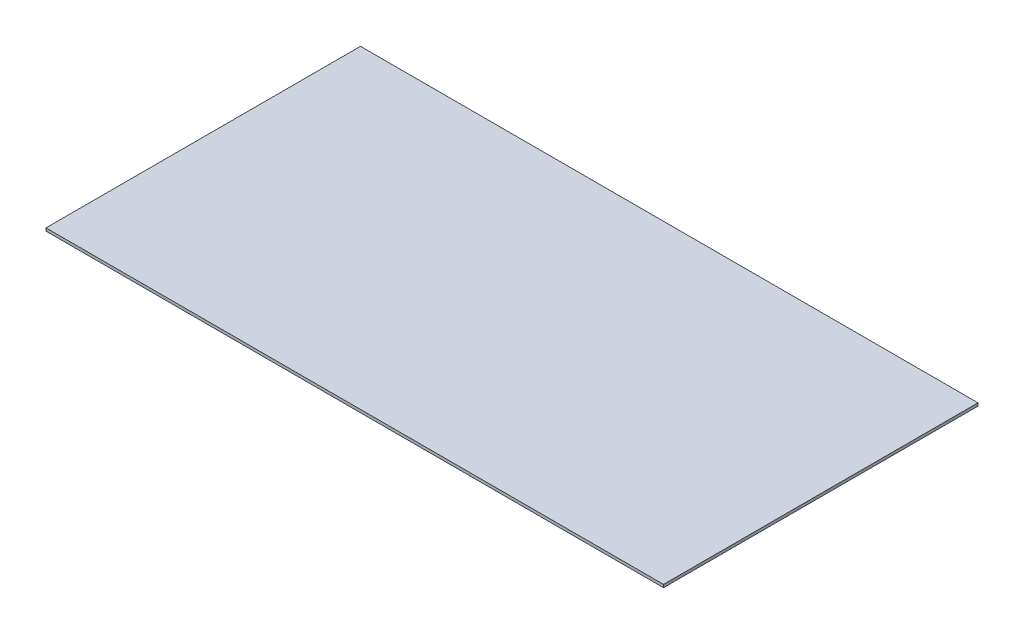
ISO-10303-21;
HEADER;
FILE_DESCRIPTION(('STEP AP214'),'2;1');
FILE_NAME('part.step','',(''),(''),'','','');
FILE_SCHEMA(('AUTOMOTIVE_DESIGN { 1 0 10303 214 1 1 1 1 }'));
ENDSEC;
DATA;
#1=APPLICATION_CONTEXT('core data for automotive mechanical design processes');
#2=APPLICATION_PROTOCOL_DEFINITION('international standard','automotive_design',2000,#1);
#3=PRODUCT_CONTEXT('',#1,'mechanical');
#4=PRODUCT('Part','Part','',(#3));
#5=PRODUCT_RELATED_PRODUCT_CATEGORY('part','',(#4));
#6=PRODUCT_DEFINITION_FORMATION('','',#4);
#7=PRODUCT_DEFINITION_CONTEXT('part definition',#1,'design');
#8=PRODUCT_DEFINITION('design','',#6,#7);
#9=PRODUCT_DEFINITION_SHAPE('','',#8);
#10=(LENGTH_UNIT() NAMED_UNIT(*) SI_UNIT(.MILLI.,.METRE.));
#11=(NAMED_UNIT(*) PLANE_ANGLE_UNIT() SI_UNIT($,.RADIAN.));
#12=(NAMED_UNIT(*) SI_UNIT($,.STERADIAN.) SOLID_ANGLE_UNIT());
#13=UNCERTAINTY_MEASURE_WITH_UNIT(LENGTH_MEASURE(1.E-05),#10,'distance_accuracy_value','');
#14=(GEOMETRIC_REPRESENTATION_CONTEXT(3) GLOBAL_UNCERTAINTY_ASSIGNED_CONTEXT((#13)) GLOBAL_UNIT_ASSIGNED_CONTEXT((#10,
#11,#12)) REPRESENTATION_CONTEXT('',''));
#15=CARTESIAN_POINT('',(0.,0.,0.));
#16=DIRECTION('',(0.,0.,1.));
#17=DIRECTION('',(1.,0.,0.));
#18=AXIS2_PLACEMENT_3D('',#15,#16,#17);
#19=CARTESIAN_POINT('',(-158.062216624685,3.175,-57.2219773299748));
#20=DIRECTION('',(1.,0.,0.));
#21=DIRECTION('',(0.,0.,-1.));
#22=AXIS2_PLACEMENT_3D('',#19,#20,#21);
#23=PLANE('',#22);
#24=DIRECTION('',(0.,0.,1.));
#25=VECTOR('',#24,1.);
#26=CARTESIAN_POINT('',(-158.062216624685,0.,-57.2219773299748));
#27=LINE('',#26,#25);
#28=CARTESIAN_POINT('',(-158.062216624685,0.,-57.2219773299748));
#29=VERTEX_POINT('',#28);
#30=CARTESIAN_POINT('',(-158.062216624685,0.,292.028022670025));
#31=VERTEX_POINT('',#30);
#32=EDGE_CURVE('E95',#29,#31,#27,.T.);
#33=ORIENTED_EDGE('',*,*,#32,.T.);
#34=DIRECTION('',(0.,-1.,0.));
#35=VECTOR('',#34,1.);
#36=CARTESIAN_POINT('',(-158.062216624685,3.175,292.028022670025));
#37=LINE('',#36,#35);
#38=CARTESIAN_POINT('',(-158.062216624685,3.175,292.028022670025));
#39=VERTEX_POINT('',#38);
#40=EDGE_CURVE('E11',#39,#31,#37,.T.);
#41=ORIENTED_EDGE('',*,*,#40,.F.);
#42=DIRECTION('',(0.,0.,1.));
#43=VECTOR('',#42,1.);
#44=CARTESIAN_POINT('',(-158.062216624685,3.175,-57.2219773299748));
#45=LINE('',#44,#43);
#46=CARTESIAN_POINT('',(-158.062216624685,3.175,-57.2219773299748));
#47=VERTEX_POINT('',#46);
#48=EDGE_CURVE('E83',#47,#39,#45,.T.);
#49=ORIENTED_EDGE('',*,*,#48,.F.);
#50=DIRECTION('',(0.,-1.,0.));
#51=VECTOR('',#50,1.);
#52=CARTESIAN_POINT('',(-158.062216624685,3.175,-57.2219773299748));
#53=LINE('',#52,#51);
#54=EDGE_CURVE('E91',#47,#29,#53,.T.);
#55=ORIENTED_EDGE('',*,*,#54,.T.);
#56=EDGE_LOOP('',(#33,#41,#49,#55));
#57=FACE_BOUND('',#56,.T.);
#58=ADVANCED_FACE('F32',(#57),#23,.F.);
#59=CARTESIAN_POINT('',(-158.062216624685,3.175,292.028022670025));
#60=DIRECTION('',(0.,0.,-1.));
#61=DIRECTION('',(-1.,0.,0.));
#62=AXIS2_PLACEMENT_3D('',#59,#60,#61);
#63=PLANE('',#62);
#64=DIRECTION('',(1.,0.,0.));
#65=VECTOR('',#64,1.);
#66=CARTESIAN_POINT('',(-158.062216624685,0.,292.028022670025));
#67=LINE('',#66,#65);
#68=CARTESIAN_POINT('',(527.737783375315,0.,292.028022670025));
#69=VERTEX_POINT('',#68);
#70=EDGE_CURVE('E87',#31,#69,#67,.T.);
#71=ORIENTED_EDGE('',*,*,#70,.T.);
#72=DIRECTION('',(0.,-1.,0.));
#73=VECTOR('',#72,1.);
#74=CARTESIAN_POINT('',(527.737783375315,3.175,292.028022670025));
#75=LINE('',#74,#73);
#76=CARTESIAN_POINT('',(527.737783375315,3.175,292.028022670025));
#77=VERTEX_POINT('',#76);
#78=EDGE_CURVE('E40',#77,#69,#75,.T.);
#79=ORIENTED_EDGE('',*,*,#78,.F.);
#80=DIRECTION('',(1.,0.,0.));
#81=VECTOR('',#80,1.);
#82=CARTESIAN_POINT('',(-158.062216624685,3.175,292.028022670025));
#83=LINE('',#82,#81);
#84=EDGE_CURVE('E78',#39,#77,#83,.T.);
#85=ORIENTED_EDGE('',*,*,#84,.F.);
#86=ORIENTED_EDGE('',*,*,#40,.T.);
#87=EDGE_LOOP('',(#71,#79,#85,#86));
#88=FACE_BOUND('',#87,.T.);
#89=ADVANCED_FACE('F86',(#88),#63,.F.);
#90=CARTESIAN_POINT('',(527.737783375315,3.175,-57.2219773299748));
#91=DIRECTION('',(-1.,0.,0.));
#92=DIRECTION('',(0.,0.,1.));
#93=AXIS2_PLACEMENT_3D('',#90,#91,#92);
#94=PLANE('',#93);
#95=DIRECTION('',(0.,0.,-1.));
#96=VECTOR('',#95,1.);
#97=CARTESIAN_POINT('',(527.737783375315,0.,-57.2219773299748));
#98=LINE('',#97,#96);
#99=CARTESIAN_POINT('',(527.737783375315,0.,-57.2219773299748));
#100=VERTEX_POINT('',#99);
#101=EDGE_CURVE('E65',#69,#100,#98,.T.);
#102=ORIENTED_EDGE('',*,*,#101,.T.);
#103=DIRECTION('',(0.,-1.,0.));
#104=VECTOR('',#103,1.);
#105=CARTESIAN_POINT('',(527.737783375315,3.175,-57.2219773299748));
#106=LINE('',#105,#104);
#107=CARTESIAN_POINT('',(527.737783375315,3.175,-57.2219773299748));
#108=VERTEX_POINT('',#107);
#109=EDGE_CURVE('E88',#108,#100,#106,.T.);
#110=ORIENTED_EDGE('',*,*,#109,.F.);
#111=DIRECTION('',(0.,0.,-1.));
#112=VECTOR('',#111,1.);
#113=CARTESIAN_POINT('',(527.737783375315,3.175,-57.2219773299748));
#114=LINE('',#113,#112);
#115=EDGE_CURVE('E81',#77,#108,#114,.T.);
#116=ORIENTED_EDGE('',*,*,#115,.F.);
#117=ORIENTED_EDGE('',*,*,#78,.T.);
#118=EDGE_LOOP('',(#102,#110,#116,#117));
#119=FACE_BOUND('',#118,.T.);
#120=ADVANCED_FACE('F89',(#119),#94,.F.);
#121=CARTESIAN_POINT('',(-158.062216624685,3.175,-57.2219773299748));
#122=DIRECTION('',(0.,0.,1.));
#123=DIRECTION('',(1.,0.,0.));
#124=AXIS2_PLACEMENT_3D('',#121,#122,#123);
#125=PLANE('',#124);
#126=DIRECTION('',(-1.,0.,0.));
#127=VECTOR('',#126,1.);
#128=CARTESIAN_POINT('',(-158.062216624685,0.,-57.2219773299748));
#129=LINE('',#128,#127);
#130=EDGE_CURVE('E71',#100,#29,#129,.T.);
#131=ORIENTED_EDGE('',*,*,#130,.T.);
#132=ORIENTED_EDGE('',*,*,#54,.F.);
#133=DIRECTION('',(-1.,0.,0.));
#134=VECTOR('',#133,1.);
#135=CARTESIAN_POINT('',(-158.062216624685,3.175,-57.2219773299748));
#136=LINE('',#135,#134);
#137=EDGE_CURVE('E48',#108,#47,#136,.T.);
#138=ORIENTED_EDGE('',*,*,#137,.F.);
#139=ORIENTED_EDGE('',*,*,#109,.T.);
#140=EDGE_LOOP('',(#131,#132,#138,#139));
#141=FACE_BOUND('',#140,.T.);
#142=ADVANCED_FACE('F102',(#141),#125,.F.);
#143=CARTESIAN_POINT('',(0.,3.175,0.));
#144=DIRECTION('',(0.,1.,0.));
#145=DIRECTION('',(0.,0.,1.));
#146=AXIS2_PLACEMENT_3D('',#143,#144,#145);
#147=PLANE('',#146);
#148=ORIENTED_EDGE('',*,*,#48,.T.);
#149=ORIENTED_EDGE('',*,*,#84,.T.);
#150=ORIENTED_EDGE('',*,*,#115,.T.);
#151=ORIENTED_EDGE('',*,*,#137,.T.);
#152=EDGE_LOOP('',(#148,#149,#150,#151));
#153=FACE_BOUND('',#152,.T.);
#154=ADVANCED_FACE('F79',(#153),#147,.T.);
#155=CARTESIAN_POINT('',(0.,0.,0.));
#156=DIRECTION('',(0.,1.,0.));
#157=DIRECTION('',(0.,0.,1.));
#158=AXIS2_PLACEMENT_3D('',#155,#156,#157);
#159=PLANE('',#158);
#160=ORIENTED_EDGE('',*,*,#32,.F.);
#161=ORIENTED_EDGE('',*,*,#130,.F.);
#162=ORIENTED_EDGE('',*,*,#101,.F.);
#163=ORIENTED_EDGE('',*,*,#70,.F.);
#164=EDGE_LOOP('',(#160,#161,#162,#163));
#165=FACE_BOUND('',#164,.T.);
#166=ADVANCED_FACE('F105',(#165),#159,.F.);
#167=CLOSED_SHELL('',(#58,#89,#120,#142,#154,#166));
#168=MANIFOLD_SOLID_BREP('B2',#167);
#169=ADVANCED_BREP_SHAPE_REPRESENTATION('',(#18,#168),#14);
#170=SHAPE_DEFINITION_REPRESENTATION(#9,#169);
ENDSEC;
END-ISO-10303-21;
